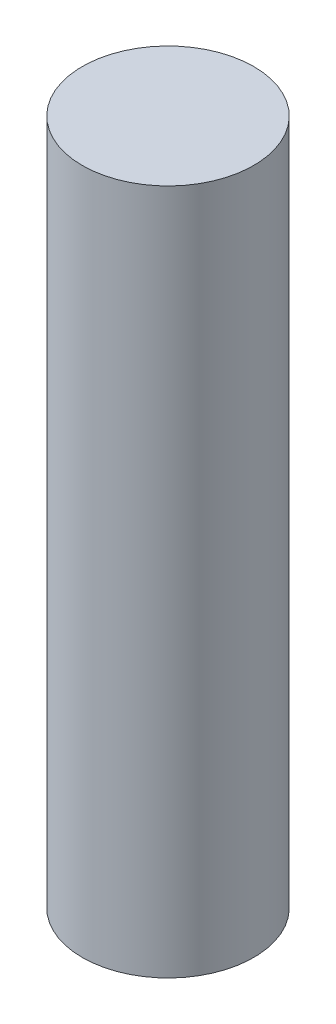
ISO-10303-21;
HEADER;
FILE_DESCRIPTION(('STEP AP214'),'2;1');
FILE_NAME('part.step','',(''),(''),'','','');
FILE_SCHEMA(('AUTOMOTIVE_DESIGN { 1 0 10303 214 1 1 1 1 }'));
ENDSEC;
DATA;
#1=APPLICATION_CONTEXT('core data for automotive mechanical design processes');
#2=APPLICATION_PROTOCOL_DEFINITION('international standard','automotive_design',2000,#1);
#3=PRODUCT_CONTEXT('',#1,'mechanical');
#4=PRODUCT('Part','Part','',(#3));
#5=PRODUCT_RELATED_PRODUCT_CATEGORY('part','',(#4));
#6=PRODUCT_DEFINITION_FORMATION('','',#4);
#7=PRODUCT_DEFINITION_CONTEXT('part definition',#1,'design');
#8=PRODUCT_DEFINITION('design','',#6,#7);
#9=PRODUCT_DEFINITION_SHAPE('','',#8);
#10=(LENGTH_UNIT() NAMED_UNIT(*) SI_UNIT(.MILLI.,.METRE.));
#11=(NAMED_UNIT(*) PLANE_ANGLE_UNIT() SI_UNIT($,.RADIAN.));
#12=(NAMED_UNIT(*) SI_UNIT($,.STERADIAN.) SOLID_ANGLE_UNIT());
#13=UNCERTAINTY_MEASURE_WITH_UNIT(LENGTH_MEASURE(1.E-05),#10,'distance_accuracy_value','');
#14=(GEOMETRIC_REPRESENTATION_CONTEXT(3) GLOBAL_UNCERTAINTY_ASSIGNED_CONTEXT((#13)) GLOBAL_UNIT_ASSIGNED_CONTEXT((#10,
#11,#12)) REPRESENTATION_CONTEXT('',''));
#15=CARTESIAN_POINT('',(0.,0.,0.));
#16=DIRECTION('',(0.,0.,1.));
#17=DIRECTION('',(1.,0.,0.));
#18=AXIS2_PLACEMENT_3D('',#15,#16,#17);
#19=CARTESIAN_POINT('',(0.,30.,0.));
#20=DIRECTION('',(0.,-1.,0.));
#21=DIRECTION('',(0.,0.,-1.));
#22=AXIS2_PLACEMENT_3D('',#19,#20,#21);
#23=CYLINDRICAL_SURFACE('',#22,3.75);
#24=CARTESIAN_POINT('',(0.,30.,0.));
#25=DIRECTION('',(0.,1.,0.));
#26=DIRECTION('',(0.,0.,1.));
#27=AXIS2_PLACEMENT_3D('',#24,#25,#26);
#28=CIRCLE('',#27,3.75);
#29=CARTESIAN_POINT('',(0.,30.,3.75));
#30=VERTEX_POINT('',#29);
#31=EDGE_CURVE('E10',#30,#30,#28,.T.);
#32=ORIENTED_EDGE('',*,*,#31,.F.);
#33=EDGE_LOOP('',(#32));
#34=FACE_BOUND('',#33,.T.);
#35=CARTESIAN_POINT('',(0.,0.,0.));
#36=DIRECTION('',(0.,1.,0.));
#37=DIRECTION('',(0.,0.,1.));
#38=AXIS2_PLACEMENT_3D('',#35,#36,#37);
#39=CIRCLE('',#38,3.75);
#40=CARTESIAN_POINT('',(0.,0.,3.75));
#41=VERTEX_POINT('',#40);
#42=EDGE_CURVE('E34',#41,#41,#39,.T.);
#43=ORIENTED_EDGE('',*,*,#42,.T.);
#44=EDGE_LOOP('',(#43));
#45=FACE_BOUND('',#44,.T.);
#46=ADVANCED_FACE('F31',(#34,#45),#23,.T.);
#47=CARTESIAN_POINT('',(0.,30.,0.));
#48=DIRECTION('',(0.,1.,0.));
#49=DIRECTION('',(0.,0.,1.));
#50=AXIS2_PLACEMENT_3D('',#47,#48,#49);
#51=PLANE('',#50);
#52=ORIENTED_EDGE('',*,*,#31,.T.);
#53=EDGE_LOOP('',(#52));
#54=FACE_BOUND('',#53,.T.);
#55=ADVANCED_FACE('F46',(#54),#51,.T.);
#56=CARTESIAN_POINT('',(0.,0.,0.));
#57=DIRECTION('',(0.,1.,0.));
#58=DIRECTION('',(0.,0.,1.));
#59=AXIS2_PLACEMENT_3D('',#56,#57,#58);
#60=PLANE('',#59);
#61=ORIENTED_EDGE('',*,*,#42,.F.);
#62=EDGE_LOOP('',(#61));
#63=FACE_BOUND('',#62,.T.);
#64=ADVANCED_FACE('F44',(#63),#60,.F.);
#65=CLOSED_SHELL('',(#46,#55,#64));
#66=MANIFOLD_SOLID_BREP('B2',#65);
#67=ADVANCED_BREP_SHAPE_REPRESENTATION('',(#18,#66),#14);
#68=SHAPE_DEFINITION_REPRESENTATION(#9,#67);
ENDSEC;
END-ISO-10303-21;
